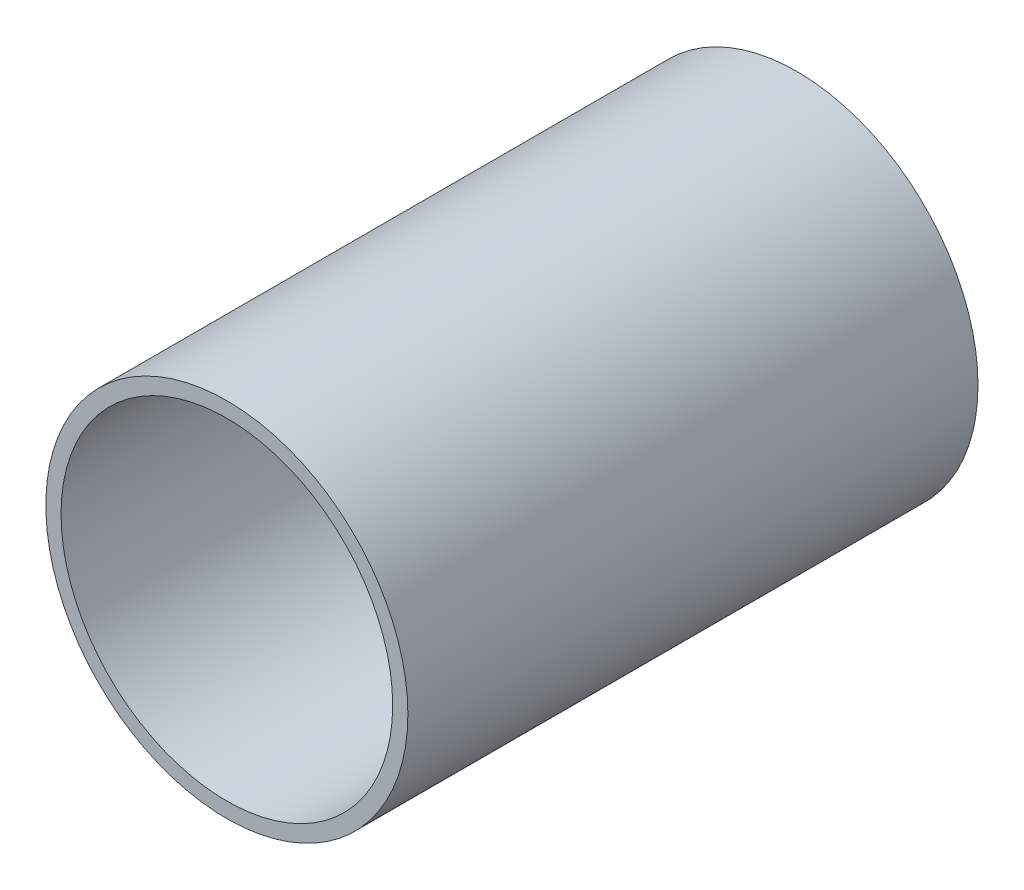
ISO-10303-21;
HEADER;
FILE_DESCRIPTION(('STEP AP214'),'2;1');
FILE_NAME('part.step','',(''),(''),'','','');
FILE_SCHEMA(('AUTOMOTIVE_DESIGN { 1 0 10303 214 1 1 1 1 }'));
ENDSEC;
DATA;
#1=APPLICATION_CONTEXT('core data for automotive mechanical design processes');
#2=APPLICATION_PROTOCOL_DEFINITION('international standard','automotive_design',2000,#1);
#3=PRODUCT_CONTEXT('',#1,'mechanical');
#4=PRODUCT('Part','Part','',(#3));
#5=PRODUCT_RELATED_PRODUCT_CATEGORY('part','',(#4));
#6=PRODUCT_DEFINITION_FORMATION('','',#4);
#7=PRODUCT_DEFINITION_CONTEXT('part definition',#1,'design');
#8=PRODUCT_DEFINITION('design','',#6,#7);
#9=PRODUCT_DEFINITION_SHAPE('','',#8);
#10=(LENGTH_UNIT() NAMED_UNIT(*) SI_UNIT(.MILLI.,.METRE.));
#11=(NAMED_UNIT(*) PLANE_ANGLE_UNIT() SI_UNIT($,.RADIAN.));
#12=(NAMED_UNIT(*) SI_UNIT($,.STERADIAN.) SOLID_ANGLE_UNIT());
#13=UNCERTAINTY_MEASURE_WITH_UNIT(LENGTH_MEASURE(1.E-05),#10,'distance_accuracy_value','');
#14=(GEOMETRIC_REPRESENTATION_CONTEXT(3) GLOBAL_UNCERTAINTY_ASSIGNED_CONTEXT((#13)) GLOBAL_UNIT_ASSIGNED_CONTEXT((#10,
#11,#12)) REPRESENTATION_CONTEXT('',''));
#15=CARTESIAN_POINT('',(0.,0.,0.));
#16=DIRECTION('',(0.,0.,1.));
#17=DIRECTION('',(1.,0.,0.));
#18=AXIS2_PLACEMENT_3D('',#15,#16,#17);
#19=CARTESIAN_POINT('',(0.,0.,60.));
#20=DIRECTION('',(0.,0.,1.));
#21=DIRECTION('',(1.,0.,0.));
#22=AXIS2_PLACEMENT_3D('',#19,#20,#21);
#23=PLANE('',#22);
#24=CARTESIAN_POINT('',(0.,0.,60.));
#25=DIRECTION('',(0.,0.,1.));
#26=DIRECTION('',(1.,0.,0.));
#27=AXIS2_PLACEMENT_3D('',#24,#25,#26);
#28=CIRCLE('',#27,19.05);
#29=CARTESIAN_POINT('',(19.05,0.,60.));
#30=VERTEX_POINT('',#29);
#31=EDGE_CURVE('E10',#30,#30,#28,.T.);
#32=ORIENTED_EDGE('',*,*,#31,.T.);
#33=EDGE_LOOP('',(#32));
#34=FACE_BOUND('',#33,.T.);
#35=CARTESIAN_POINT('',(0.,0.,60.));
#36=DIRECTION('',(0.,0.,1.));
#37=DIRECTION('',(1.,0.,0.));
#38=AXIS2_PLACEMENT_3D('',#35,#36,#37);
#39=CIRCLE('',#38,17.45);
#40=CARTESIAN_POINT('',(17.45,0.,60.));
#41=VERTEX_POINT('',#40);
#42=EDGE_CURVE('E46',#41,#41,#39,.T.);
#43=ORIENTED_EDGE('',*,*,#42,.F.);
#44=EDGE_LOOP('',(#43));
#45=FACE_BOUND('',#44,.T.);
#46=ADVANCED_FACE('F35',(#34,#45),#23,.T.);
#47=CARTESIAN_POINT('',(0.,0.,0.));
#48=DIRECTION('',(0.,0.,1.));
#49=DIRECTION('',(1.,0.,0.));
#50=AXIS2_PLACEMENT_3D('',#47,#48,#49);
#51=PLANE('',#50);
#52=CARTESIAN_POINT('',(0.,0.,0.));
#53=DIRECTION('',(0.,0.,1.));
#54=DIRECTION('',(1.,0.,0.));
#55=AXIS2_PLACEMENT_3D('',#52,#53,#54);
#56=CIRCLE('',#55,19.05);
#57=CARTESIAN_POINT('',(19.05,0.,0.));
#58=VERTEX_POINT('',#57);
#59=EDGE_CURVE('E39',#58,#58,#56,.T.);
#60=ORIENTED_EDGE('',*,*,#59,.F.);
#61=EDGE_LOOP('',(#60));
#62=FACE_BOUND('',#61,.T.);
#63=CARTESIAN_POINT('',(0.,0.,0.));
#64=DIRECTION('',(0.,0.,1.));
#65=DIRECTION('',(1.,0.,0.));
#66=AXIS2_PLACEMENT_3D('',#63,#64,#65);
#67=CIRCLE('',#66,17.45);
#68=CARTESIAN_POINT('',(17.45,0.,0.));
#69=VERTEX_POINT('',#68);
#70=EDGE_CURVE('E48',#69,#69,#67,.T.);
#71=ORIENTED_EDGE('',*,*,#70,.T.);
#72=EDGE_LOOP('',(#71));
#73=FACE_BOUND('',#72,.T.);
#74=ADVANCED_FACE('F58',(#62,#73),#51,.F.);
#75=CARTESIAN_POINT('',(0.,0.,60.));
#76=DIRECTION('',(0.,0.,-1.));
#77=DIRECTION('',(-1.,0.,0.));
#78=AXIS2_PLACEMENT_3D('',#75,#76,#77);
#79=CYLINDRICAL_SURFACE('',#78,19.05);
#80=ORIENTED_EDGE('',*,*,#31,.F.);
#81=EDGE_LOOP('',(#80));
#82=FACE_BOUND('',#81,.T.);
#83=ORIENTED_EDGE('',*,*,#59,.T.);
#84=EDGE_LOOP('',(#83));
#85=FACE_BOUND('',#84,.T.);
#86=ADVANCED_FACE('F37',(#82,#85),#79,.T.);
#87=CARTESIAN_POINT('',(0.,0.,60.));
#88=DIRECTION('',(0.,0.,-1.));
#89=DIRECTION('',(-1.,0.,0.));
#90=AXIS2_PLACEMENT_3D('',#87,#88,#89);
#91=CYLINDRICAL_SURFACE('',#90,17.45);
#92=ORIENTED_EDGE('',*,*,#42,.T.);
#93=EDGE_LOOP('',(#92));
#94=FACE_BOUND('',#93,.T.);
#95=ORIENTED_EDGE('',*,*,#70,.F.);
#96=EDGE_LOOP('',(#95));
#97=FACE_BOUND('',#96,.T.);
#98=ADVANCED_FACE('F54',(#94,#97),#91,.F.);
#99=CLOSED_SHELL('',(#46,#74,#86,#98));
#100=MANIFOLD_SOLID_BREP('B2',#99);
#101=ADVANCED_BREP_SHAPE_REPRESENTATION('',(#18,#100),#14);
#102=SHAPE_DEFINITION_REPRESENTATION(#9,#101);
ENDSEC;
END-ISO-10303-21;
